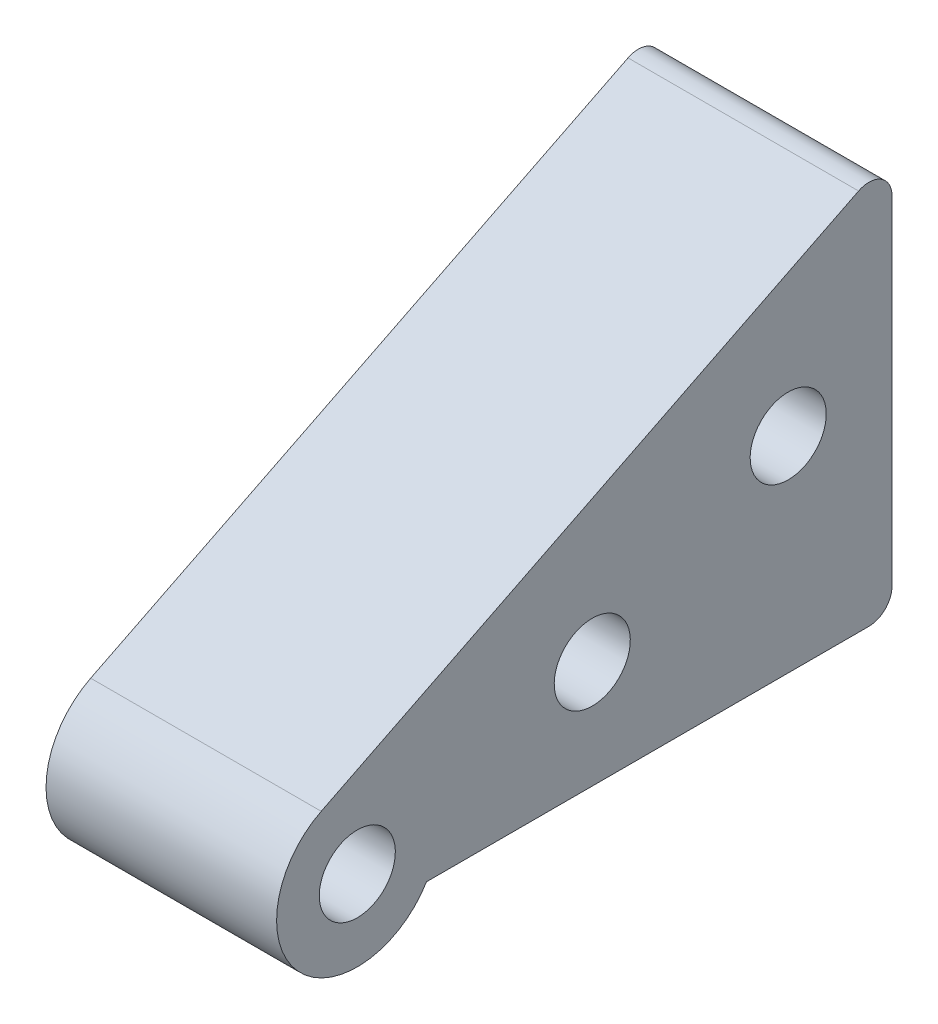
ISO-10303-21;
HEADER;
FILE_DESCRIPTION(('STEP AP214'),'2;1');
FILE_NAME('part.step','',(''),(''),'','','');
FILE_SCHEMA(('AUTOMOTIVE_DESIGN { 1 0 10303 214 1 1 1 1 }'));
ENDSEC;
DATA;
#1=APPLICATION_CONTEXT('core data for automotive mechanical design processes');
#2=APPLICATION_PROTOCOL_DEFINITION('international standard','automotive_design',2000,#1);
#3=PRODUCT_CONTEXT('',#1,'mechanical');
#4=PRODUCT('Part','Part','',(#3));
#5=PRODUCT_RELATED_PRODUCT_CATEGORY('part','',(#4));
#6=PRODUCT_DEFINITION_FORMATION('','',#4);
#7=PRODUCT_DEFINITION_CONTEXT('part definition',#1,'design');
#8=PRODUCT_DEFINITION('design','',#6,#7);
#9=PRODUCT_DEFINITION_SHAPE('','',#8);
#10=(LENGTH_UNIT() NAMED_UNIT(*) SI_UNIT(.MILLI.,.METRE.));
#11=(NAMED_UNIT(*) PLANE_ANGLE_UNIT() SI_UNIT($,.RADIAN.));
#12=(NAMED_UNIT(*) SI_UNIT($,.STERADIAN.) SOLID_ANGLE_UNIT());
#13=UNCERTAINTY_MEASURE_WITH_UNIT(LENGTH_MEASURE(1.E-05),#10,'distance_accuracy_value','');
#14=(GEOMETRIC_REPRESENTATION_CONTEXT(3) GLOBAL_UNCERTAINTY_ASSIGNED_CONTEXT((#13)) GLOBAL_UNIT_ASSIGNED_CONTEXT((#10,
#11,#12)) REPRESENTATION_CONTEXT('',''));
#15=CARTESIAN_POINT('',(0.,0.,0.));
#16=DIRECTION('',(0.,0.,1.));
#17=DIRECTION('',(1.,0.,0.));
#18=AXIS2_PLACEMENT_3D('',#15,#16,#17);
#19=CARTESIAN_POINT('',(34.55,0.,0.));
#20=DIRECTION('',(1.,0.,0.));
#21=DIRECTION('',(0.,-1.,0.));
#22=AXIS2_PLACEMENT_3D('',#19,#20,#21);
#23=PLANE('',#22);
#24=CARTESIAN_POINT('',(34.55,8.10626133417408,22.9992433006019));
#25=DIRECTION('',(-1.,0.,0.));
#26=DIRECTION('',(0.,-1.,0.));
#27=AXIS2_PLACEMENT_3D('',#24,#25,#26);
#28=CIRCLE('',#27,1.65);
#29=CARTESIAN_POINT('',(34.55,6.45626133417408,22.9992433006019));
#30=VERTEX_POINT('',#29);
#31=EDGE_CURVE('E242',#30,#30,#28,.T.);
#32=ORIENTED_EDGE('',*,*,#31,.T.);
#33=EDGE_LOOP('',(#32));
#34=FACE_BOUND('',#33,.T.);
#35=CARTESIAN_POINT('',(34.55,5.25000000000001,33.19));
#36=DIRECTION('',(-1.,0.,0.));
#37=DIRECTION('',(0.,-1.,0.));
#38=AXIS2_PLACEMENT_3D('',#35,#36,#37);
#39=CIRCLE('',#38,1.65);
#40=CARTESIAN_POINT('',(34.55,3.60000000000001,33.19));
#41=VERTEX_POINT('',#40);
#42=EDGE_CURVE('E246',#41,#41,#39,.T.);
#43=ORIENTED_EDGE('',*,*,#42,.T.);
#44=EDGE_LOOP('',(#43));
#45=FACE_BOUND('',#44,.T.);
#46=CARTESIAN_POINT('',(34.55,12.3530954475528,14.5));
#47=DIRECTION('',(-1.,0.,0.));
#48=DIRECTION('',(0.,-1.,0.));
#49=AXIS2_PLACEMENT_3D('',#46,#47,#48);
#50=CIRCLE('',#49,1.65);
#51=CARTESIAN_POINT('',(34.55,10.7030954475528,14.5));
#52=VERTEX_POINT('',#51);
#53=EDGE_CURVE('E135',#52,#52,#50,.T.);
#54=ORIENTED_EDGE('',*,*,#53,.T.);
#55=EDGE_LOOP('',(#54));
#56=FACE_BOUND('',#55,.T.);
#57=DIRECTION('',(0.,1.,0.));
#58=VECTOR('',#57,1.);
#59=CARTESIAN_POINT('',(34.55,0.,10.));
#60=LINE('',#59,#58);
#61=CARTESIAN_POINT('',(34.55,4.45000000000001,10.));
#62=VERTEX_POINT('',#61);
#63=CARTESIAN_POINT('',(34.55,19.132440622231,10.));
#64=VERTEX_POINT('',#63);
#65=EDGE_CURVE('E98',#62,#64,#60,.T.);
#66=ORIENTED_EDGE('',*,*,#65,.T.);
#67=CARTESIAN_POINT('',(34.55,19.132440622231,11.));
#68=DIRECTION('',(1.,0.,0.));
#69=DIRECTION('',(0.,1.,0.));
#70=AXIS2_PLACEMENT_3D('',#67,#68,#69);
#71=CIRCLE('',#70,1.);
#72=CARTESIAN_POINT('',(34.55,20.0269851376292,11.4469788697142));
#73=VERTEX_POINT('',#72);
#74=EDGE_CURVE('E123',#64,#73,#71,.T.);
#75=ORIENTED_EDGE('',*,*,#74,.T.);
#76=DIRECTION('',(0.,0.446978869714198,-0.89454451539821));
#77=VECTOR('',#76,1.);
#78=CARTESIAN_POINT('',(34.55,20.6027801821194,10.2946329000457));
#79=LINE('',#78,#77);
#80=CARTESIAN_POINT('',(34.55,8.38090580389375,34.7544260439997));
#81=VERTEX_POINT('',#80);
#82=EDGE_CURVE('E111',#81,#73,#79,.T.);
#83=ORIENTED_EDGE('',*,*,#82,.F.);
#84=CARTESIAN_POINT('',(34.55,5.25000000000001,33.19));
#85=DIRECTION('',(-1.,0.,0.));
#86=DIRECTION('',(0.,-1.,0.));
#87=AXIS2_PLACEMENT_3D('',#84,#85,#86);
#88=CIRCLE('',#87,3.5);
#89=CARTESIAN_POINT('',(34.55,3.45000000000001,30.1883337960393));
#90=VERTEX_POINT('',#89);
#91=EDGE_CURVE('E109',#81,#90,#88,.F.);
#92=ORIENTED_EDGE('',*,*,#91,.T.);
#93=DIRECTION('',(0.,0.,-1.));
#94=VECTOR('',#93,1.);
#95=CARTESIAN_POINT('',(34.55,3.45000000000001,0.));
#96=LINE('',#95,#94);
#97=CARTESIAN_POINT('',(34.55,3.45000000000001,11.));
#98=VERTEX_POINT('',#97);
#99=EDGE_CURVE('E144',#90,#98,#96,.T.);
#100=ORIENTED_EDGE('',*,*,#99,.T.);
#101=CARTESIAN_POINT('',(34.55,4.45000000000001,11.));
#102=DIRECTION('',(1.,0.,0.));
#103=DIRECTION('',(0.,1.,0.));
#104=AXIS2_PLACEMENT_3D('',#101,#102,#103);
#105=CIRCLE('',#104,1.);
#106=EDGE_CURVE('E121',#98,#62,#105,.T.);
#107=ORIENTED_EDGE('',*,*,#106,.T.);
#108=EDGE_LOOP('',(#66,#75,#83,#92,#100,#107));
#109=FACE_BOUND('',#108,.T.);
#110=ADVANCED_FACE('F37',(#34,#45,#56,#109),#23,.T.);
#111=CARTESIAN_POINT('',(24.55,0.,0.));
#112=DIRECTION('',(-1.,0.,0.));
#113=DIRECTION('',(0.,1.,0.));
#114=AXIS2_PLACEMENT_3D('',#111,#112,#113);
#115=PLANE('',#114);
#116=CARTESIAN_POINT('',(24.55,8.10626133417408,22.9992433006019));
#117=DIRECTION('',(-1.,0.,0.));
#118=DIRECTION('',(0.,-1.,0.));
#119=AXIS2_PLACEMENT_3D('',#116,#117,#118);
#120=CIRCLE('',#119,1.65);
#121=CARTESIAN_POINT('',(24.55,6.45626133417408,22.9992433006019));
#122=VERTEX_POINT('',#121);
#123=EDGE_CURVE('E245',#122,#122,#120,.T.);
#124=ORIENTED_EDGE('',*,*,#123,.F.);
#125=EDGE_LOOP('',(#124));
#126=FACE_BOUND('',#125,.T.);
#127=CARTESIAN_POINT('',(24.55,5.25000000000001,33.19));
#128=DIRECTION('',(-1.,0.,0.));
#129=DIRECTION('',(0.,-1.,0.));
#130=AXIS2_PLACEMENT_3D('',#127,#128,#129);
#131=CIRCLE('',#130,1.65);
#132=CARTESIAN_POINT('',(24.55,3.60000000000001,33.19));
#133=VERTEX_POINT('',#132);
#134=EDGE_CURVE('E251',#133,#133,#131,.T.);
#135=ORIENTED_EDGE('',*,*,#134,.F.);
#136=EDGE_LOOP('',(#135));
#137=FACE_BOUND('',#136,.T.);
#138=CARTESIAN_POINT('',(24.55,12.3530954475528,14.5));
#139=DIRECTION('',(-1.,0.,0.));
#140=DIRECTION('',(0.,-1.,0.));
#141=AXIS2_PLACEMENT_3D('',#138,#139,#140);
#142=CIRCLE('',#141,1.65);
#143=CARTESIAN_POINT('',(24.55,10.7030954475528,14.5));
#144=VERTEX_POINT('',#143);
#145=EDGE_CURVE('E248',#144,#144,#142,.T.);
#146=ORIENTED_EDGE('',*,*,#145,.F.);
#147=EDGE_LOOP('',(#146));
#148=FACE_BOUND('',#147,.T.);
#149=DIRECTION('',(0.,-0.446978869714198,0.89454451539821));
#150=VECTOR('',#149,1.);
#151=CARTESIAN_POINT('',(24.55,20.6027801821194,10.2946329000457));
#152=LINE('',#151,#150);
#153=CARTESIAN_POINT('',(24.55,20.0269851376292,11.4469788697142));
#154=VERTEX_POINT('',#153);
#155=CARTESIAN_POINT('',(24.55,8.38090580389375,34.7544260439997));
#156=VERTEX_POINT('',#155);
#157=EDGE_CURVE('E90',#154,#156,#152,.T.);
#158=ORIENTED_EDGE('',*,*,#157,.F.);
#159=CARTESIAN_POINT('',(24.55,19.132440622231,11.));
#160=DIRECTION('',(-1.,0.,0.));
#161=DIRECTION('',(0.,-1.,0.));
#162=AXIS2_PLACEMENT_3D('',#159,#160,#161);
#163=CIRCLE('',#162,1.);
#164=CARTESIAN_POINT('',(24.55,19.132440622231,10.));
#165=VERTEX_POINT('',#164);
#166=EDGE_CURVE('E45',#154,#165,#163,.T.);
#167=ORIENTED_EDGE('',*,*,#166,.T.);
#168=DIRECTION('',(0.,1.,0.));
#169=VECTOR('',#168,1.);
#170=CARTESIAN_POINT('',(24.55,0.,10.));
#171=LINE('',#170,#169);
#172=CARTESIAN_POINT('',(24.55,4.45000000000001,10.));
#173=VERTEX_POINT('',#172);
#174=EDGE_CURVE('E127',#173,#165,#171,.T.);
#175=ORIENTED_EDGE('',*,*,#174,.F.);
#176=CARTESIAN_POINT('',(24.55,4.45000000000001,11.));
#177=DIRECTION('',(-1.,0.,0.));
#178=DIRECTION('',(0.,-1.,0.));
#179=AXIS2_PLACEMENT_3D('',#176,#177,#178);
#180=CIRCLE('',#179,1.);
#181=CARTESIAN_POINT('',(24.55,3.45000000000001,11.));
#182=VERTEX_POINT('',#181);
#183=EDGE_CURVE('E52',#173,#182,#180,.T.);
#184=ORIENTED_EDGE('',*,*,#183,.T.);
#185=DIRECTION('',(0.,0.,-1.));
#186=VECTOR('',#185,1.);
#187=CARTESIAN_POINT('',(24.55,3.45000000000001,0.));
#188=LINE('',#187,#186);
#189=CARTESIAN_POINT('',(24.55,3.45000000000001,30.1883337960393));
#190=VERTEX_POINT('',#189);
#191=EDGE_CURVE('E102',#190,#182,#188,.T.);
#192=ORIENTED_EDGE('',*,*,#191,.F.);
#193=CARTESIAN_POINT('',(24.55,5.25000000000001,33.19));
#194=DIRECTION('',(-1.,0.,0.));
#195=DIRECTION('',(0.,-1.,0.));
#196=AXIS2_PLACEMENT_3D('',#193,#194,#195);
#197=CIRCLE('',#196,3.5);
#198=EDGE_CURVE('E97',#156,#190,#197,.F.);
#199=ORIENTED_EDGE('',*,*,#198,.F.);
#200=EDGE_LOOP('',(#158,#167,#175,#184,#192,#199));
#201=FACE_BOUND('',#200,.T.);
#202=ADVANCED_FACE('F101',(#126,#137,#148,#201),#115,.T.);
#203=CARTESIAN_POINT('',(90.8917277768017,3.45000000000003,0.));
#204=DIRECTION('',(0.,-1.,0.));
#205=DIRECTION('',(0.,0.,-1.));
#206=AXIS2_PLACEMENT_3D('',#203,#204,#205);
#207=PLANE('',#206);
#208=ORIENTED_EDGE('',*,*,#191,.T.);
#209=DIRECTION('',(1.,0.,0.));
#210=VECTOR('',#209,1.);
#211=CARTESIAN_POINT('',(90.8917277768017,3.45000000000003,11.));
#212=LINE('',#211,#210);
#213=EDGE_CURVE('E13',#182,#98,#212,.T.);
#214=ORIENTED_EDGE('',*,*,#213,.T.);
#215=ORIENTED_EDGE('',*,*,#99,.F.);
#216=DIRECTION('',(-1.,0.,0.));
#217=VECTOR('',#216,1.);
#218=CARTESIAN_POINT('',(90.8917277768017,3.45000000000003,30.1883337960393));
#219=LINE('',#218,#217);
#220=EDGE_CURVE('E110',#90,#190,#219,.T.);
#221=ORIENTED_EDGE('',*,*,#220,.T.);
#222=EDGE_LOOP('',(#208,#214,#215,#221));
#223=FACE_BOUND('',#222,.T.);
#224=ADVANCED_FACE('F147',(#223),#207,.T.);
#225=CARTESIAN_POINT('',(90.8917277768017,20.6027801821194,10.2946329000457));
#226=DIRECTION('',(0.,-0.89454451539821,-0.446978869714198));
#227=DIRECTION('',(0.,0.446978869714198,-0.89454451539821));
#228=AXIS2_PLACEMENT_3D('',#225,#226,#227);
#229=PLANE('',#228);
#230=ORIENTED_EDGE('',*,*,#82,.T.);
#231=DIRECTION('',(1.,0.,0.));
#232=VECTOR('',#231,1.);
#233=CARTESIAN_POINT('',(24.55,20.0269851376292,11.4469788697142));
#234=LINE('',#233,#232);
#235=EDGE_CURVE('E60',#73,#154,#234,.F.);
#236=ORIENTED_EDGE('',*,*,#235,.T.);
#237=ORIENTED_EDGE('',*,*,#157,.T.);
#238=DIRECTION('',(-1.,0.,0.));
#239=VECTOR('',#238,1.);
#240=CARTESIAN_POINT('',(90.8917277768017,8.38090580389377,34.7544260439997));
#241=LINE('',#240,#239);
#242=EDGE_CURVE('E94',#81,#156,#241,.T.);
#243=ORIENTED_EDGE('',*,*,#242,.F.);
#244=EDGE_LOOP('',(#230,#236,#237,#243));
#245=FACE_BOUND('',#244,.T.);
#246=ADVANCED_FACE('F92',(#245),#229,.F.);
#247=CARTESIAN_POINT('',(90.8917277768017,5.25000000000003,33.19));
#248=DIRECTION('',(-1.,0.,0.));
#249=DIRECTION('',(0.,0.,-1.));
#250=AXIS2_PLACEMENT_3D('',#247,#248,#249);
#251=CYLINDRICAL_SURFACE('',#250,3.5);
#252=ORIENTED_EDGE('',*,*,#242,.T.);
#253=ORIENTED_EDGE('',*,*,#198,.T.);
#254=ORIENTED_EDGE('',*,*,#220,.F.);
#255=ORIENTED_EDGE('',*,*,#91,.F.);
#256=EDGE_LOOP('',(#252,#253,#254,#255));
#257=FACE_BOUND('',#256,.T.);
#258=ADVANCED_FACE('F107',(#257),#251,.T.);
#259=CARTESIAN_POINT('',(24.55,0.,10.));
#260=DIRECTION('',(0.,0.,-1.));
#261=DIRECTION('',(0.,1.,0.));
#262=AXIS2_PLACEMENT_3D('',#259,#260,#261);
#263=PLANE('',#262);
#264=ORIENTED_EDGE('',*,*,#174,.T.);
#265=DIRECTION('',(1.,0.,0.));
#266=VECTOR('',#265,1.);
#267=CARTESIAN_POINT('',(24.55,19.132440622231,10.));
#268=LINE('',#267,#266);
#269=EDGE_CURVE('E118',#165,#64,#268,.T.);
#270=ORIENTED_EDGE('',*,*,#269,.T.);
#271=ORIENTED_EDGE('',*,*,#65,.F.);
#272=DIRECTION('',(1.,0.,0.));
#273=VECTOR('',#272,1.);
#274=CARTESIAN_POINT('',(24.55,4.45000000000001,10.));
#275=LINE('',#274,#273);
#276=EDGE_CURVE('E113',#62,#173,#275,.F.);
#277=ORIENTED_EDGE('',*,*,#276,.T.);
#278=EDGE_LOOP('',(#264,#270,#271,#277));
#279=FACE_BOUND('',#278,.T.);
#280=ADVANCED_FACE('F131',(#279),#263,.T.);
#281=CARTESIAN_POINT('',(24.55,19.132440622231,11.));
#282=DIRECTION('',(-1.,0.,0.));
#283=DIRECTION('',(0.,-1.,0.));
#284=AXIS2_PLACEMENT_3D('',#281,#282,#283);
#285=CYLINDRICAL_SURFACE('',#284,1.);
#286=ORIENTED_EDGE('',*,*,#166,.F.);
#287=ORIENTED_EDGE('',*,*,#235,.F.);
#288=ORIENTED_EDGE('',*,*,#74,.F.);
#289=ORIENTED_EDGE('',*,*,#269,.F.);
#290=EDGE_LOOP('',(#286,#287,#288,#289));
#291=FACE_BOUND('',#290,.T.);
#292=ADVANCED_FACE('F137',(#291),#285,.T.);
#293=CARTESIAN_POINT('',(90.8917277768017,4.45000000000003,11.));
#294=DIRECTION('',(1.,0.,0.));
#295=DIRECTION('',(0.,1.,0.));
#296=AXIS2_PLACEMENT_3D('',#293,#294,#295);
#297=CYLINDRICAL_SURFACE('',#296,1.);
#298=ORIENTED_EDGE('',*,*,#183,.F.);
#299=ORIENTED_EDGE('',*,*,#276,.F.);
#300=ORIENTED_EDGE('',*,*,#106,.F.);
#301=ORIENTED_EDGE('',*,*,#213,.F.);
#302=EDGE_LOOP('',(#298,#299,#300,#301));
#303=FACE_BOUND('',#302,.T.);
#304=ADVANCED_FACE('F39',(#303),#297,.T.);
#305=CARTESIAN_POINT('',(34.55,12.3530954475528,14.5));
#306=DIRECTION('',(-1.,0.,0.));
#307=DIRECTION('',(0.,-1.,0.));
#308=AXIS2_PLACEMENT_3D('',#305,#306,#307);
#309=CYLINDRICAL_SURFACE('',#308,1.65);
#310=ORIENTED_EDGE('',*,*,#53,.F.);
#311=EDGE_LOOP('',(#310));
#312=FACE_BOUND('',#311,.T.);
#313=ORIENTED_EDGE('',*,*,#145,.T.);
#314=EDGE_LOOP('',(#313));
#315=FACE_BOUND('',#314,.T.);
#316=ADVANCED_FACE('F151',(#312,#315),#309,.F.);
#317=CARTESIAN_POINT('',(34.55,5.25000000000001,33.19));
#318=DIRECTION('',(-1.,0.,0.));
#319=DIRECTION('',(0.,-1.,0.));
#320=AXIS2_PLACEMENT_3D('',#317,#318,#319);
#321=CYLINDRICAL_SURFACE('',#320,1.65);
#322=ORIENTED_EDGE('',*,*,#42,.F.);
#323=EDGE_LOOP('',(#322));
#324=FACE_BOUND('',#323,.T.);
#325=ORIENTED_EDGE('',*,*,#134,.T.);
#326=EDGE_LOOP('',(#325));
#327=FACE_BOUND('',#326,.T.);
#328=ADVANCED_FACE('F156',(#324,#327),#321,.F.);
#329=CARTESIAN_POINT('',(34.55,8.10626133417408,22.9992433006019));
#330=DIRECTION('',(-1.,0.,0.));
#331=DIRECTION('',(0.,-1.,0.));
#332=AXIS2_PLACEMENT_3D('',#329,#330,#331);
#333=CYLINDRICAL_SURFACE('',#332,1.65);
#334=ORIENTED_EDGE('',*,*,#31,.F.);
#335=EDGE_LOOP('',(#334));
#336=FACE_BOUND('',#335,.T.);
#337=ORIENTED_EDGE('',*,*,#123,.T.);
#338=EDGE_LOOP('',(#337));
#339=FACE_BOUND('',#338,.T.);
#340=ADVANCED_FACE('F226',(#336,#339),#333,.F.);
#341=CLOSED_SHELL('',(#110,#202,#224,#246,#258,#280,#292,#304,#316,#328,#340));
#342=MANIFOLD_SOLID_BREP('B2',#341);
#343=ADVANCED_BREP_SHAPE_REPRESENTATION('',(#18,#342),#14);
#344=SHAPE_DEFINITION_REPRESENTATION(#9,#343);
ENDSEC;
END-ISO-10303-21;
